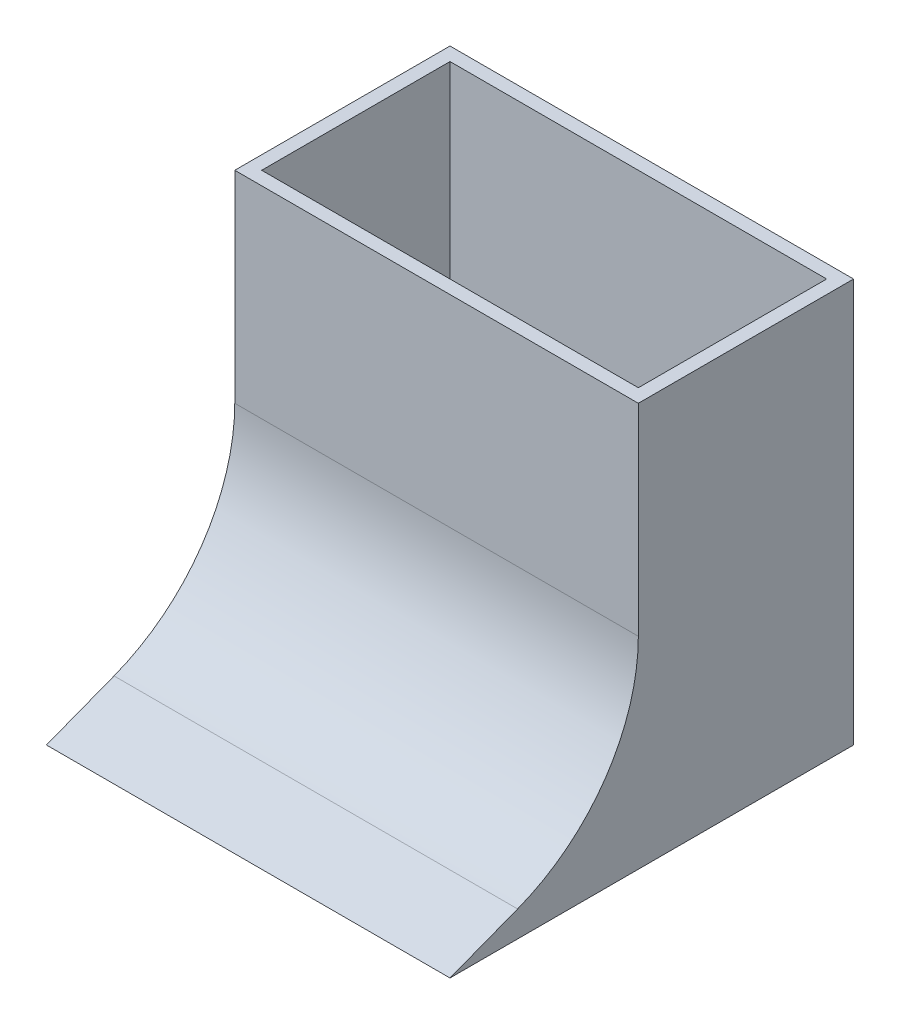
ISO-10303-21;
HEADER;
FILE_DESCRIPTION(('STEP AP214'),'2;1');
FILE_NAME('part.step','',(''),(''),'','','');
FILE_SCHEMA(('AUTOMOTIVE_DESIGN { 1 0 10303 214 1 1 1 1 }'));
ENDSEC;
DATA;
#1=APPLICATION_CONTEXT('core data for automotive mechanical design processes');
#2=APPLICATION_PROTOCOL_DEFINITION('international standard','automotive_design',2000,#1);
#3=PRODUCT_CONTEXT('',#1,'mechanical');
#4=PRODUCT('Part','Part','',(#3));
#5=PRODUCT_RELATED_PRODUCT_CATEGORY('part','',(#4));
#6=PRODUCT_DEFINITION_FORMATION('','',#4);
#7=PRODUCT_DEFINITION_CONTEXT('part definition',#1,'design');
#8=PRODUCT_DEFINITION('design','',#6,#7);
#9=PRODUCT_DEFINITION_SHAPE('','',#8);
#10=(LENGTH_UNIT() NAMED_UNIT(*) SI_UNIT(.MILLI.,.METRE.));
#11=(NAMED_UNIT(*) PLANE_ANGLE_UNIT() SI_UNIT($,.RADIAN.));
#12=(NAMED_UNIT(*) SI_UNIT($,.STERADIAN.) SOLID_ANGLE_UNIT());
#13=UNCERTAINTY_MEASURE_WITH_UNIT(LENGTH_MEASURE(1.E-05),#10,'distance_accuracy_value','');
#14=(GEOMETRIC_REPRESENTATION_CONTEXT(3) GLOBAL_UNCERTAINTY_ASSIGNED_CONTEXT((#13)) GLOBAL_UNIT_ASSIGNED_CONTEXT((#10,
#11,#12)) REPRESENTATION_CONTEXT('',''));
#15=CARTESIAN_POINT('',(0.,0.,0.));
#16=DIRECTION('',(0.,0.,1.));
#17=DIRECTION('',(1.,0.,0.));
#18=AXIS2_PLACEMENT_3D('',#15,#16,#17);
#19=CARTESIAN_POINT('',(42.,45.,-45.));
#20=DIRECTION('',(1.,0.,0.));
#21=DIRECTION('',(0.,0.,-1.));
#22=AXIS2_PLACEMENT_3D('',#19,#20,#21);
#23=PLANE('',#22);
#24=DIRECTION('',(0.,0.,-1.));
#25=VECTOR('',#24,1.);
#26=CARTESIAN_POINT('',(42.,45.,-42.));
#27=LINE('',#26,#25);
#28=CARTESIAN_POINT('',(42.,45.,0.));
#29=VERTEX_POINT('',#28);
#30=CARTESIAN_POINT('',(42.,45.,-42.));
#31=VERTEX_POINT('',#30);
#32=EDGE_CURVE('E178',#29,#31,#27,.T.);
#33=ORIENTED_EDGE('',*,*,#32,.T.);
#34=DIRECTION('',(0.,1.,0.));
#35=VECTOR('',#34,1.);
#36=CARTESIAN_POINT('',(42.,-42.,-42.));
#37=LINE('',#36,#35);
#38=CARTESIAN_POINT('',(42.,-42.,-42.));
#39=VERTEX_POINT('',#38);
#40=EDGE_CURVE('E171',#39,#31,#37,.T.);
#41=ORIENTED_EDGE('',*,*,#40,.F.);
#42=DIRECTION('',(0.,0.,-1.));
#43=VECTOR('',#42,1.);
#44=CARTESIAN_POINT('',(42.,-42.,-42.));
#45=LINE('',#44,#43);
#46=CARTESIAN_POINT('',(42.,-42.,28.8445055785964));
#47=VERTEX_POINT('',#46);
#48=EDGE_CURVE('E201',#47,#39,#45,.T.);
#49=ORIENTED_EDGE('',*,*,#48,.F.);
#50=CARTESIAN_POINT('',(42.,0.,45.));
#51=DIRECTION('',(1.,0.,0.));
#52=DIRECTION('',(0.,0.,-1.));
#53=AXIS2_PLACEMENT_3D('',#50,#51,#52);
#54=CIRCLE('',#53,45.);
#55=CARTESIAN_POINT('',(42.,0.,0.));
#56=VERTEX_POINT('',#55);
#57=EDGE_CURVE('E91',#47,#56,#54,.T.);
#58=ORIENTED_EDGE('',*,*,#57,.T.);
#59=DIRECTION('',(0.,1.,0.));
#60=VECTOR('',#59,1.);
#61=CARTESIAN_POINT('',(42.,45.,0.));
#62=LINE('',#61,#60);
#63=EDGE_CURVE('E84',#56,#29,#62,.T.);
#64=ORIENTED_EDGE('',*,*,#63,.T.);
#65=EDGE_LOOP('',(#33,#41,#49,#58,#64));
#66=FACE_BOUND('',#65,.T.);
#67=ADVANCED_FACE('F69',(#66),#23,.F.);
#68=CARTESIAN_POINT('',(-42.,45.,45.));
#69=DIRECTION('',(-1.,0.,0.));
#70=DIRECTION('',(0.,0.,1.));
#71=AXIS2_PLACEMENT_3D('',#68,#69,#70);
#72=PLANE('',#71);
#73=DIRECTION('',(0.,-1.,0.));
#74=VECTOR('',#73,1.);
#75=CARTESIAN_POINT('',(-42.,45.,0.));
#76=LINE('',#75,#74);
#77=CARTESIAN_POINT('',(-42.,45.,0.));
#78=VERTEX_POINT('',#77);
#79=CARTESIAN_POINT('',(-42.,0.,0.));
#80=VERTEX_POINT('',#79);
#81=EDGE_CURVE('E12',#78,#80,#76,.T.);
#82=ORIENTED_EDGE('',*,*,#81,.T.);
#83=CARTESIAN_POINT('',(-42.,0.,45.));
#84=DIRECTION('',(-1.,0.,0.));
#85=DIRECTION('',(0.,0.,1.));
#86=AXIS2_PLACEMENT_3D('',#83,#84,#85);
#87=CIRCLE('',#86,45.);
#88=CARTESIAN_POINT('',(-42.,-42.,28.8445055785964));
#89=VERTEX_POINT('',#88);
#90=EDGE_CURVE('E165',#80,#89,#87,.T.);
#91=ORIENTED_EDGE('',*,*,#90,.T.);
#92=DIRECTION('',(0.,0.,1.));
#93=VECTOR('',#92,1.);
#94=CARTESIAN_POINT('',(-42.,-42.,-42.));
#95=LINE('',#94,#93);
#96=CARTESIAN_POINT('',(-42.,-42.,-42.));
#97=VERTEX_POINT('',#96);
#98=EDGE_CURVE('E161',#97,#89,#95,.T.);
#99=ORIENTED_EDGE('',*,*,#98,.F.);
#100=DIRECTION('',(0.,-1.,0.));
#101=VECTOR('',#100,1.);
#102=CARTESIAN_POINT('',(-42.,-42.,-42.));
#103=LINE('',#102,#101);
#104=CARTESIAN_POINT('',(-42.,45.,-42.));
#105=VERTEX_POINT('',#104);
#106=EDGE_CURVE('E154',#105,#97,#103,.T.);
#107=ORIENTED_EDGE('',*,*,#106,.F.);
#108=DIRECTION('',(0.,0.,1.));
#109=VECTOR('',#108,1.);
#110=CARTESIAN_POINT('',(-42.,45.,-42.));
#111=LINE('',#110,#109);
#112=EDGE_CURVE('E158',#105,#78,#111,.T.);
#113=ORIENTED_EDGE('',*,*,#112,.T.);
#114=EDGE_LOOP('',(#82,#91,#99,#107,#113));
#115=FACE_BOUND('',#114,.T.);
#116=ADVANCED_FACE('F156',(#115),#72,.F.);
#117=CARTESIAN_POINT('',(45.,45.,0.));
#118=DIRECTION('',(0.,0.,1.));
#119=DIRECTION('',(1.,0.,0.));
#120=AXIS2_PLACEMENT_3D('',#117,#118,#119);
#121=PLANE('',#120);
#122=ORIENTED_EDGE('',*,*,#63,.F.);
#123=DIRECTION('',(-1.,0.,0.));
#124=VECTOR('',#123,1.);
#125=CARTESIAN_POINT('',(45.,0.,0.));
#126=LINE('',#125,#124);
#127=EDGE_CURVE('E205',#56,#80,#126,.T.);
#128=ORIENTED_EDGE('',*,*,#127,.T.);
#129=ORIENTED_EDGE('',*,*,#81,.F.);
#130=DIRECTION('',(1.,0.,0.));
#131=VECTOR('',#130,1.);
#132=CARTESIAN_POINT('',(42.,45.,0.));
#133=LINE('',#132,#131);
#134=EDGE_CURVE('E176',#78,#29,#133,.T.);
#135=ORIENTED_EDGE('',*,*,#134,.T.);
#136=EDGE_LOOP('',(#122,#128,#129,#135));
#137=FACE_BOUND('',#136,.T.);
#138=ADVANCED_FACE('F284',(#137),#121,.F.);
#139=CARTESIAN_POINT('',(45.,-42.,-42.));
#140=DIRECTION('',(0.,0.,1.));
#141=DIRECTION('',(1.,0.,0.));
#142=AXIS2_PLACEMENT_3D('',#139,#140,#141);
#143=PLANE('',#142);
#144=ORIENTED_EDGE('',*,*,#106,.T.);
#145=DIRECTION('',(-1.,0.,0.));
#146=VECTOR('',#145,1.);
#147=CARTESIAN_POINT('',(45.,-42.,-42.));
#148=LINE('',#147,#146);
#149=EDGE_CURVE('E216',#39,#97,#148,.T.);
#150=ORIENTED_EDGE('',*,*,#149,.F.);
#151=ORIENTED_EDGE('',*,*,#40,.T.);
#152=DIRECTION('',(-1.,0.,0.));
#153=VECTOR('',#152,1.);
#154=CARTESIAN_POINT('',(42.,45.,-42.));
#155=LINE('',#154,#153);
#156=EDGE_CURVE('E168',#31,#105,#155,.T.);
#157=ORIENTED_EDGE('',*,*,#156,.T.);
#158=EDGE_LOOP('',(#144,#150,#151,#157));
#159=FACE_BOUND('',#158,.T.);
#160=ADVANCED_FACE('F169',(#159),#143,.T.);
#161=CARTESIAN_POINT('',(45.,-42.,-42.));
#162=DIRECTION('',(0.,1.,0.));
#163=DIRECTION('',(0.,0.,1.));
#164=AXIS2_PLACEMENT_3D('',#161,#162,#163);
#165=PLANE('',#164);
#166=DIRECTION('',(-1.,0.,0.));
#167=VECTOR('',#166,1.);
#168=CARTESIAN_POINT('',(45.,-42.,28.8445055785964));
#169=LINE('',#168,#167);
#170=EDGE_CURVE('E210',#89,#47,#169,.F.);
#171=ORIENTED_EDGE('',*,*,#170,.T.);
#172=ORIENTED_EDGE('',*,*,#48,.T.);
#173=ORIENTED_EDGE('',*,*,#149,.T.);
#174=ORIENTED_EDGE('',*,*,#98,.T.);
#175=EDGE_LOOP('',(#171,#172,#173,#174));
#176=FACE_BOUND('',#175,.T.);
#177=ADVANCED_FACE('F275',(#176),#165,.T.);
#178=CARTESIAN_POINT('',(45.,0.,45.));
#179=DIRECTION('',(-1.,0.,0.));
#180=DIRECTION('',(0.,0.,1.));
#181=AXIS2_PLACEMENT_3D('',#178,#179,#180);
#182=CYLINDRICAL_SURFACE('',#181,45.);
#183=ORIENTED_EDGE('',*,*,#57,.F.);
#184=ORIENTED_EDGE('',*,*,#170,.F.);
#185=ORIENTED_EDGE('',*,*,#90,.F.);
#186=ORIENTED_EDGE('',*,*,#127,.F.);
#187=EDGE_LOOP('',(#183,#184,#185,#186));
#188=FACE_BOUND('',#187,.T.);
#189=ADVANCED_FACE('F267',(#188),#182,.T.);
#190=CARTESIAN_POINT('',(45.,45.,-42.));
#191=DIRECTION('',(0.,-1.,0.));
#192=DIRECTION('',(0.,0.,-1.));
#193=AXIS2_PLACEMENT_3D('',#190,#191,#192);
#194=PLANE('',#193);
#195=DIRECTION('',(0.,0.,1.));
#196=VECTOR('',#195,1.);
#197=CARTESIAN_POINT('',(-45.,45.,-42.));
#198=LINE('',#197,#196);
#199=CARTESIAN_POINT('',(-45.,45.,-45.));
#200=VERTEX_POINT('',#199);
#201=CARTESIAN_POINT('',(-45.,45.,3.));
#202=VERTEX_POINT('',#201);
#203=EDGE_CURVE('E222',#200,#202,#198,.T.);
#204=ORIENTED_EDGE('',*,*,#203,.T.);
#205=DIRECTION('',(1.,0.,0.));
#206=VECTOR('',#205,1.);
#207=CARTESIAN_POINT('',(-45.,45.,2.99999999999999));
#208=LINE('',#207,#206);
#209=CARTESIAN_POINT('',(45.,45.,3.));
#210=VERTEX_POINT('',#209);
#211=EDGE_CURVE('E208',#202,#210,#208,.T.);
#212=ORIENTED_EDGE('',*,*,#211,.T.);
#213=DIRECTION('',(0.,0.,1.));
#214=VECTOR('',#213,1.);
#215=CARTESIAN_POINT('',(45.,45.,-42.));
#216=LINE('',#215,#214);
#217=CARTESIAN_POINT('',(45.,45.,-45.));
#218=VERTEX_POINT('',#217);
#219=EDGE_CURVE('E224',#218,#210,#216,.T.);
#220=ORIENTED_EDGE('',*,*,#219,.F.);
#221=DIRECTION('',(-1.,0.,0.));
#222=VECTOR('',#221,1.);
#223=CARTESIAN_POINT('',(45.,45.,-45.));
#224=LINE('',#223,#222);
#225=EDGE_CURVE('E227',#218,#200,#224,.T.);
#226=ORIENTED_EDGE('',*,*,#225,.T.);
#227=EDGE_LOOP('',(#204,#212,#220,#226));
#228=FACE_BOUND('',#227,.T.);
#229=ORIENTED_EDGE('',*,*,#156,.F.);
#230=ORIENTED_EDGE('',*,*,#32,.F.);
#231=ORIENTED_EDGE('',*,*,#134,.F.);
#232=ORIENTED_EDGE('',*,*,#112,.F.);
#233=EDGE_LOOP('',(#229,#230,#231,#232));
#234=FACE_BOUND('',#233,.T.);
#235=ADVANCED_FACE('F175',(#228,#234),#194,.F.);
#236=CARTESIAN_POINT('',(45.,0.,45.));
#237=DIRECTION('',(-1.,0.,0.));
#238=DIRECTION('',(0.,0.,1.));
#239=AXIS2_PLACEMENT_3D('',#236,#237,#238);
#240=CYLINDRICAL_SURFACE('',#239,42.);
#241=DIRECTION('',(1.,0.,0.));
#242=VECTOR('',#241,1.);
#243=CARTESIAN_POINT('',(-45.,-39.2000300065564,29.9216165493419));
#244=LINE('',#243,#242);
#245=CARTESIAN_POINT('',(-45.,-39.2000300065564,29.9216165493419));
#246=VERTEX_POINT('',#245);
#247=CARTESIAN_POINT('',(45.,-39.2000300065564,29.9216165493419));
#248=VERTEX_POINT('',#247);
#249=EDGE_CURVE('E207',#246,#248,#244,.T.);
#250=ORIENTED_EDGE('',*,*,#249,.T.);
#251=CARTESIAN_POINT('',(45.,0.,45.));
#252=DIRECTION('',(1.,0.,0.));
#253=DIRECTION('',(0.,0.,-1.));
#254=AXIS2_PLACEMENT_3D('',#251,#252,#253);
#255=CIRCLE('',#254,42.);
#256=CARTESIAN_POINT('',(45.,0.,2.99999999999998));
#257=VERTEX_POINT('',#256);
#258=EDGE_CURVE('E188',#248,#257,#255,.T.);
#259=ORIENTED_EDGE('',*,*,#258,.T.);
#260=DIRECTION('',(1.,0.,0.));
#261=VECTOR('',#260,1.);
#262=CARTESIAN_POINT('',(-45.,0.,2.99999999999999));
#263=LINE('',#262,#261);
#264=CARTESIAN_POINT('',(-45.,0.,2.99999999999998));
#265=VERTEX_POINT('',#264);
#266=EDGE_CURVE('E211',#265,#257,#263,.T.);
#267=ORIENTED_EDGE('',*,*,#266,.F.);
#268=CARTESIAN_POINT('',(-45.,0.,45.));
#269=DIRECTION('',(1.,0.,0.));
#270=DIRECTION('',(0.,0.,-1.));
#271=AXIS2_PLACEMENT_3D('',#268,#269,#270);
#272=CIRCLE('',#271,42.);
#273=EDGE_CURVE('E190',#246,#265,#272,.T.);
#274=ORIENTED_EDGE('',*,*,#273,.F.);
#275=EDGE_LOOP('',(#250,#259,#267,#274));
#276=FACE_BOUND('',#275,.T.);
#277=ADVANCED_FACE('F261',(#276),#240,.F.);
#278=CARTESIAN_POINT('',(-45.,0.,2.99999999999999));
#279=DIRECTION('',(0.,0.,-1.));
#280=DIRECTION('',(-1.,0.,0.));
#281=AXIS2_PLACEMENT_3D('',#278,#279,#280);
#282=PLANE('',#281);
#283=ORIENTED_EDGE('',*,*,#266,.T.);
#284=DIRECTION('',(0.,1.,0.));
#285=VECTOR('',#284,1.);
#286=CARTESIAN_POINT('',(45.,0.,3.));
#287=LINE('',#286,#285);
#288=EDGE_CURVE('E192',#257,#210,#287,.T.);
#289=ORIENTED_EDGE('',*,*,#288,.T.);
#290=ORIENTED_EDGE('',*,*,#211,.F.);
#291=DIRECTION('',(0.,1.,0.));
#292=VECTOR('',#291,1.);
#293=CARTESIAN_POINT('',(-45.,0.,3.));
#294=LINE('',#293,#292);
#295=EDGE_CURVE('E195',#265,#202,#294,.T.);
#296=ORIENTED_EDGE('',*,*,#295,.F.);
#297=EDGE_LOOP('',(#283,#289,#290,#296));
#298=FACE_BOUND('',#297,.T.);
#299=ADVANCED_FACE('F264',(#298),#282,.F.);
#300=CARTESIAN_POINT('',(-45.,-45.,45.));
#301=DIRECTION('',(0.,-0.933333333331485,-0.359010987147105));
#302=DIRECTION('',(0.,0.359010987147105,-0.933333333331485));
#303=AXIS2_PLACEMENT_3D('',#300,#301,#302);
#304=PLANE('',#303);
#305=DIRECTION('',(0.,0.359010987147103,-0.933333333331486));
#306=VECTOR('',#305,1.);
#307=CARTESIAN_POINT('',(-45.,-45.,45.));
#308=LINE('',#307,#306);
#309=CARTESIAN_POINT('',(-45.,-45.,45.));
#310=VERTEX_POINT('',#309);
#311=EDGE_CURVE('E185',#310,#246,#308,.T.);
#312=ORIENTED_EDGE('',*,*,#311,.F.);
#313=DIRECTION('',(-1.,0.,0.));
#314=VECTOR('',#313,1.);
#315=CARTESIAN_POINT('',(45.,-45.,45.));
#316=LINE('',#315,#314);
#317=CARTESIAN_POINT('',(45.,-45.,45.));
#318=VERTEX_POINT('',#317);
#319=EDGE_CURVE('E77',#318,#310,#316,.T.);
#320=ORIENTED_EDGE('',*,*,#319,.F.);
#321=DIRECTION('',(0.,0.359010987147103,-0.933333333331486));
#322=VECTOR('',#321,1.);
#323=CARTESIAN_POINT('',(45.,-45.,45.));
#324=LINE('',#323,#322);
#325=EDGE_CURVE('E182',#318,#248,#324,.T.);
#326=ORIENTED_EDGE('',*,*,#325,.T.);
#327=ORIENTED_EDGE('',*,*,#249,.F.);
#328=EDGE_LOOP('',(#312,#320,#326,#327));
#329=FACE_BOUND('',#328,.T.);
#330=ADVANCED_FACE('F245',(#329),#304,.F.);
#331=CARTESIAN_POINT('',(45.,0.,0.));
#332=DIRECTION('',(1.,0.,0.));
#333=DIRECTION('',(0.,0.,-1.));
#334=AXIS2_PLACEMENT_3D('',#331,#332,#333);
#335=PLANE('',#334);
#336=ORIENTED_EDGE('',*,*,#325,.F.);
#337=DIRECTION('',(0.,0.,-1.));
#338=VECTOR('',#337,1.);
#339=CARTESIAN_POINT('',(45.,-45.,-42.));
#340=LINE('',#339,#338);
#341=CARTESIAN_POINT('',(45.,-45.,-45.));
#342=VERTEX_POINT('',#341);
#343=EDGE_CURVE('E219',#318,#342,#340,.T.);
#344=ORIENTED_EDGE('',*,*,#343,.T.);
#345=DIRECTION('',(0.,1.,0.));
#346=VECTOR('',#345,1.);
#347=CARTESIAN_POINT('',(45.,-42.,-45.));
#348=LINE('',#347,#346);
#349=EDGE_CURVE('E221',#342,#218,#348,.T.);
#350=ORIENTED_EDGE('',*,*,#349,.T.);
#351=ORIENTED_EDGE('',*,*,#219,.T.);
#352=ORIENTED_EDGE('',*,*,#288,.F.);
#353=ORIENTED_EDGE('',*,*,#258,.F.);
#354=EDGE_LOOP('',(#336,#344,#350,#351,#352,#353));
#355=FACE_BOUND('',#354,.T.);
#356=ADVANCED_FACE('F256',(#355),#335,.T.);
#357=CARTESIAN_POINT('',(-45.,0.,0.));
#358=DIRECTION('',(1.,0.,0.));
#359=DIRECTION('',(0.,0.,-1.));
#360=AXIS2_PLACEMENT_3D('',#357,#358,#359);
#361=PLANE('',#360);
#362=DIRECTION('',(0.,0.,-1.));
#363=VECTOR('',#362,1.);
#364=CARTESIAN_POINT('',(-45.,-45.,-42.));
#365=LINE('',#364,#363);
#366=CARTESIAN_POINT('',(-45.,-45.,-45.));
#367=VERTEX_POINT('',#366);
#368=EDGE_CURVE('E218',#310,#367,#365,.T.);
#369=ORIENTED_EDGE('',*,*,#368,.F.);
#370=ORIENTED_EDGE('',*,*,#311,.T.);
#371=ORIENTED_EDGE('',*,*,#273,.T.);
#372=ORIENTED_EDGE('',*,*,#295,.T.);
#373=ORIENTED_EDGE('',*,*,#203,.F.);
#374=DIRECTION('',(0.,1.,0.));
#375=VECTOR('',#374,1.);
#376=CARTESIAN_POINT('',(-45.,-42.,-45.));
#377=LINE('',#376,#375);
#378=EDGE_CURVE('E230',#367,#200,#377,.T.);
#379=ORIENTED_EDGE('',*,*,#378,.F.);
#380=EDGE_LOOP('',(#369,#370,#371,#372,#373,#379));
#381=FACE_BOUND('',#380,.T.);
#382=ADVANCED_FACE('F248',(#381),#361,.F.);
#383=CARTESIAN_POINT('',(45.,-45.,-42.));
#384=DIRECTION('',(0.,1.,0.));
#385=DIRECTION('',(0.,0.,1.));
#386=AXIS2_PLACEMENT_3D('',#383,#384,#385);
#387=PLANE('',#386);
#388=ORIENTED_EDGE('',*,*,#319,.T.);
#389=ORIENTED_EDGE('',*,*,#368,.T.);
#390=DIRECTION('',(-1.,0.,0.));
#391=VECTOR('',#390,1.);
#392=CARTESIAN_POINT('',(45.,-45.,-45.));
#393=LINE('',#392,#391);
#394=EDGE_CURVE('E236',#342,#367,#393,.T.);
#395=ORIENTED_EDGE('',*,*,#394,.F.);
#396=ORIENTED_EDGE('',*,*,#343,.F.);
#397=EDGE_LOOP('',(#388,#389,#395,#396));
#398=FACE_BOUND('',#397,.T.);
#399=ADVANCED_FACE('F71',(#398),#387,.F.);
#400=CARTESIAN_POINT('',(45.,-42.,-45.));
#401=DIRECTION('',(0.,0.,1.));
#402=DIRECTION('',(1.,0.,0.));
#403=AXIS2_PLACEMENT_3D('',#400,#401,#402);
#404=PLANE('',#403);
#405=ORIENTED_EDGE('',*,*,#394,.T.);
#406=ORIENTED_EDGE('',*,*,#378,.T.);
#407=ORIENTED_EDGE('',*,*,#225,.F.);
#408=ORIENTED_EDGE('',*,*,#349,.F.);
#409=EDGE_LOOP('',(#405,#406,#407,#408));
#410=FACE_BOUND('',#409,.T.);
#411=ADVANCED_FACE('F252',(#410),#404,.F.);
#412=CLOSED_SHELL('',(#67,#116,#138,#160,#177,#189,#235,#277,#299,#330,#356,#382,#399,#411));
#413=MANIFOLD_SOLID_BREP('B2',#412);
#414=ADVANCED_BREP_SHAPE_REPRESENTATION('',(#18,#413),#14);
#415=SHAPE_DEFINITION_REPRESENTATION(#9,#414);
ENDSEC;
END-ISO-10303-21;
